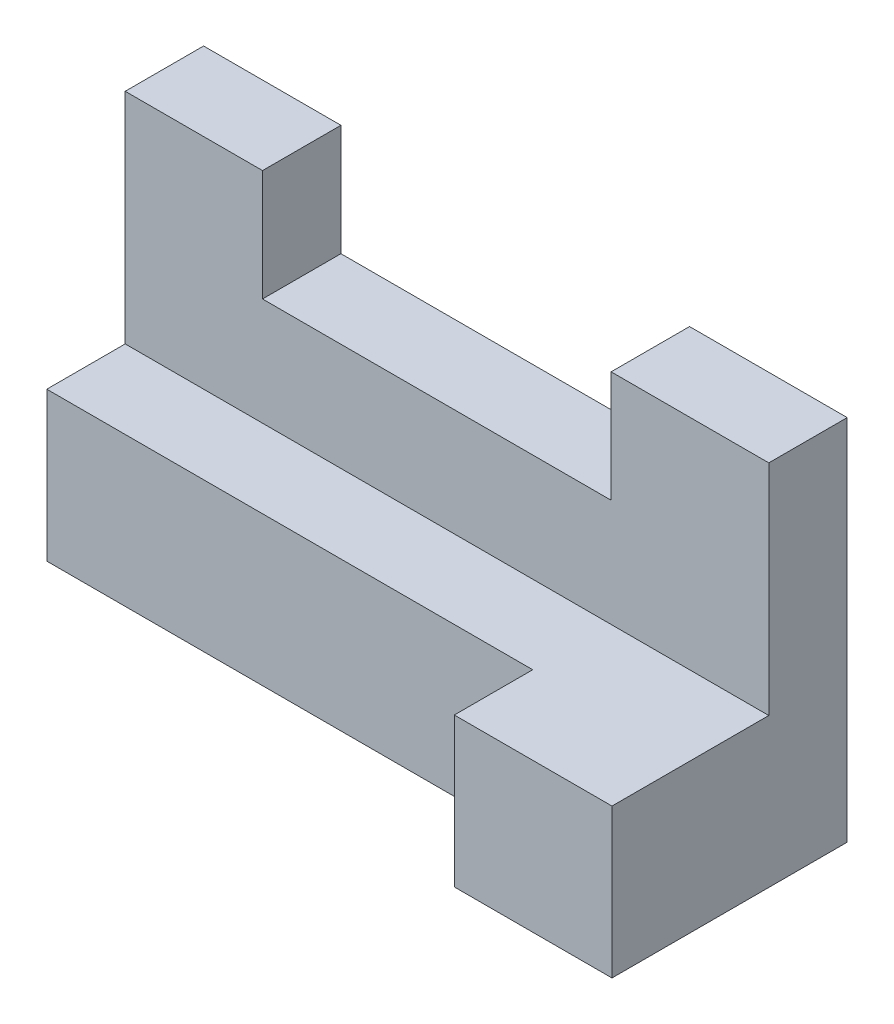
ISO-10303-21;
HEADER;
FILE_DESCRIPTION(('STEP AP214'),'2;1');
FILE_NAME('part.step','',(''),(''),'','','');
FILE_SCHEMA(('AUTOMOTIVE_DESIGN { 1 0 10303 214 1 1 1 1 }'));
ENDSEC;
DATA;
#1=APPLICATION_CONTEXT('core data for automotive mechanical design processes');
#2=APPLICATION_PROTOCOL_DEFINITION('international standard','automotive_design',2000,#1);
#3=PRODUCT_CONTEXT('',#1,'mechanical');
#4=PRODUCT('Part','Part','',(#3));
#5=PRODUCT_RELATED_PRODUCT_CATEGORY('part','',(#4));
#6=PRODUCT_DEFINITION_FORMATION('','',#4);
#7=PRODUCT_DEFINITION_CONTEXT('part definition',#1,'design');
#8=PRODUCT_DEFINITION('design','',#6,#7);
#9=PRODUCT_DEFINITION_SHAPE('','',#8);
#10=(LENGTH_UNIT() NAMED_UNIT(*) SI_UNIT(.MILLI.,.METRE.));
#11=(NAMED_UNIT(*) PLANE_ANGLE_UNIT() SI_UNIT($,.RADIAN.));
#12=(NAMED_UNIT(*) SI_UNIT($,.STERADIAN.) SOLID_ANGLE_UNIT());
#13=UNCERTAINTY_MEASURE_WITH_UNIT(LENGTH_MEASURE(1.E-05),#10,'distance_accuracy_value','');
#14=(GEOMETRIC_REPRESENTATION_CONTEXT(3) GLOBAL_UNCERTAINTY_ASSIGNED_CONTEXT((#13)) GLOBAL_UNIT_ASSIGNED_CONTEXT((#10,
#11,#12)) REPRESENTATION_CONTEXT('',''));
#15=CARTESIAN_POINT('',(0.,0.,0.));
#16=DIRECTION('',(0.,0.,1.));
#17=DIRECTION('',(1.,0.,0.));
#18=AXIS2_PLACEMENT_3D('',#15,#16,#17);
#19=CARTESIAN_POINT('',(-21.9935635111595,0.,10.));
#20=DIRECTION('',(-1.,0.,0.));
#21=DIRECTION('',(0.,0.,1.));
#22=AXIS2_PLACEMENT_3D('',#19,#20,#21);
#23=PLANE('',#22);
#24=DIRECTION('',(0.,1.,0.));
#25=VECTOR('',#24,1.);
#26=CARTESIAN_POINT('',(-21.9935635111595,0.,0.));
#27=LINE('',#26,#25);
#28=CARTESIAN_POINT('',(-21.9935635111595,13.7198793548755,0.));
#29=VERTEX_POINT('',#28);
#30=CARTESIAN_POINT('',(-21.9935635111595,27.9037178757274,0.));
#31=VERTEX_POINT('',#30);
#32=EDGE_CURVE('E124',#29,#31,#27,.T.);
#33=ORIENTED_EDGE('',*,*,#32,.T.);
#34=DIRECTION('',(0.,0.,-1.));
#35=VECTOR('',#34,1.);
#36=CARTESIAN_POINT('',(-21.9935635111595,27.9037178757274,10.));
#37=LINE('',#36,#35);
#38=CARTESIAN_POINT('',(-21.9935635111595,27.9037178757274,10.));
#39=VERTEX_POINT('',#38);
#40=EDGE_CURVE('E11',#39,#31,#37,.T.);
#41=ORIENTED_EDGE('',*,*,#40,.F.);
#42=DIRECTION('',(0.,1.,0.));
#43=VECTOR('',#42,1.);
#44=CARTESIAN_POINT('',(-21.9935635111595,0.,10.));
#45=LINE('',#44,#43);
#46=CARTESIAN_POINT('',(-21.9935635111595,13.7198793548755,10.));
#47=VERTEX_POINT('',#46);
#48=EDGE_CURVE('E139',#47,#39,#45,.T.);
#49=ORIENTED_EDGE('',*,*,#48,.F.);
#50=DIRECTION('',(0.,0.,-1.));
#51=VECTOR('',#50,1.);
#52=CARTESIAN_POINT('',(-21.9935635111595,13.7198793548755,10.));
#53=LINE('',#52,#51);
#54=EDGE_CURVE('E120',#47,#29,#53,.T.);
#55=ORIENTED_EDGE('',*,*,#54,.T.);
#56=EDGE_LOOP('',(#33,#41,#49,#55));
#57=FACE_BOUND('',#56,.T.);
#58=ADVANCED_FACE('F33',(#57),#23,.F.);
#59=CARTESIAN_POINT('',(0.,27.9037178757274,10.));
#60=DIRECTION('',(0.,-1.,0.));
#61=DIRECTION('',(0.,0.,-1.));
#62=AXIS2_PLACEMENT_3D('',#59,#60,#61);
#63=PLANE('',#62);
#64=DIRECTION('',(-1.,0.,0.));
#65=VECTOR('',#64,1.);
#66=CARTESIAN_POINT('',(0.,27.9037178757274,0.));
#67=LINE('',#66,#65);
#68=CARTESIAN_POINT('',(-39.5062947243976,27.9037178757274,0.));
#69=VERTEX_POINT('',#68);
#70=EDGE_CURVE('E127',#31,#69,#67,.T.);
#71=ORIENTED_EDGE('',*,*,#70,.T.);
#72=DIRECTION('',(0.,0.,-1.));
#73=VECTOR('',#72,1.);
#74=CARTESIAN_POINT('',(-39.5062947243976,27.9037178757274,10.));
#75=LINE('',#74,#73);
#76=CARTESIAN_POINT('',(-39.5062947243976,27.9037178757274,10.));
#77=VERTEX_POINT('',#76);
#78=EDGE_CURVE('E41',#77,#69,#75,.T.);
#79=ORIENTED_EDGE('',*,*,#78,.F.);
#80=DIRECTION('',(-1.,0.,0.));
#81=VECTOR('',#80,1.);
#82=CARTESIAN_POINT('',(0.,27.9037178757274,10.));
#83=LINE('',#82,#81);
#84=EDGE_CURVE('E87',#39,#77,#83,.T.);
#85=ORIENTED_EDGE('',*,*,#84,.F.);
#86=ORIENTED_EDGE('',*,*,#40,.T.);
#87=EDGE_LOOP('',(#71,#79,#85,#86));
#88=FACE_BOUND('',#87,.T.);
#89=ADVANCED_FACE('F152',(#88),#63,.F.);
#90=CARTESIAN_POINT('',(-39.5062947243976,0.,10.));
#91=DIRECTION('',(-1.,0.,0.));
#92=DIRECTION('',(0.,0.,1.));
#93=AXIS2_PLACEMENT_3D('',#90,#91,#92);
#94=PLANE('',#93);
#95=DIRECTION('',(0.,1.,0.));
#96=VECTOR('',#95,1.);
#97=CARTESIAN_POINT('',(-39.5062947243976,0.,0.));
#98=LINE('',#97,#96);
#99=CARTESIAN_POINT('',(-39.5062947243976,-18.992234217222,0.));
#100=VERTEX_POINT('',#99);
#101=EDGE_CURVE('E131',#100,#69,#98,.T.);
#102=ORIENTED_EDGE('',*,*,#101,.F.);
#103=DIRECTION('',(0.,0.,-1.));
#104=VECTOR('',#103,1.);
#105=CARTESIAN_POINT('',(-39.5062947243976,-18.992234217222,20.));
#106=LINE('',#105,#104);
#107=CARTESIAN_POINT('',(-39.5062947243976,-18.992234217222,20.));
#108=VERTEX_POINT('',#107);
#109=EDGE_CURVE('E170',#108,#100,#106,.T.);
#110=ORIENTED_EDGE('',*,*,#109,.F.);
#111=DIRECTION('',(0.,-1.,0.));
#112=VECTOR('',#111,1.);
#113=CARTESIAN_POINT('',(-39.5062947243976,0.,20.));
#114=LINE('',#113,#112);
#115=CARTESIAN_POINT('',(-39.5062947243976,0.,20.));
#116=VERTEX_POINT('',#115);
#117=EDGE_CURVE('E179',#116,#108,#114,.T.);
#118=ORIENTED_EDGE('',*,*,#117,.F.);
#119=DIRECTION('',(0.,0.,-1.));
#120=VECTOR('',#119,1.);
#121=CARTESIAN_POINT('',(-39.5062947243976,0.,20.));
#122=LINE('',#121,#120);
#123=CARTESIAN_POINT('',(-39.5062947243976,0.,10.));
#124=VERTEX_POINT('',#123);
#125=EDGE_CURVE('E167',#116,#124,#122,.T.);
#126=ORIENTED_EDGE('',*,*,#125,.T.);
#127=DIRECTION('',(0.,1.,0.));
#128=VECTOR('',#127,1.);
#129=CARTESIAN_POINT('',(-39.5062947243976,0.,10.));
#130=LINE('',#129,#128);
#131=EDGE_CURVE('E151',#124,#77,#130,.T.);
#132=ORIENTED_EDGE('',*,*,#131,.T.);
#133=ORIENTED_EDGE('',*,*,#78,.T.);
#134=EDGE_LOOP('',(#102,#110,#118,#126,#132,#133));
#135=FACE_BOUND('',#134,.T.);
#136=ADVANCED_FACE('F145',(#135),#94,.T.);
#137=CARTESIAN_POINT('',(42.5747448000789,0.,10.));
#138=DIRECTION('',(-1.,0.,0.));
#139=DIRECTION('',(0.,0.,1.));
#140=AXIS2_PLACEMENT_3D('',#137,#138,#139);
#141=PLANE('',#140);
#142=DIRECTION('',(0.,1.,0.));
#143=VECTOR('',#142,1.);
#144=CARTESIAN_POINT('',(42.5747448000789,0.,0.));
#145=LINE('',#144,#143);
#146=CARTESIAN_POINT('',(42.5747448000789,-18.992234217222,0.));
#147=VERTEX_POINT('',#146);
#148=CARTESIAN_POINT('',(42.5747448000789,27.9037178757274,0.));
#149=VERTEX_POINT('',#148);
#150=EDGE_CURVE('E134',#147,#149,#145,.T.);
#151=ORIENTED_EDGE('',*,*,#150,.T.);
#152=DIRECTION('',(0.,0.,-1.));
#153=VECTOR('',#152,1.);
#154=CARTESIAN_POINT('',(42.5747448000789,27.9037178757274,10.));
#155=LINE('',#154,#153);
#156=CARTESIAN_POINT('',(42.5747448000789,27.9037178757274,10.));
#157=VERTEX_POINT('',#156);
#158=EDGE_CURVE('E115',#157,#149,#155,.T.);
#159=ORIENTED_EDGE('',*,*,#158,.F.);
#160=DIRECTION('',(0.,1.,0.));
#161=VECTOR('',#160,1.);
#162=CARTESIAN_POINT('',(42.5747448000789,0.,10.));
#163=LINE('',#162,#161);
#164=CARTESIAN_POINT('',(42.5747448000789,0.,10.));
#165=VERTEX_POINT('',#164);
#166=EDGE_CURVE('E106',#165,#157,#163,.T.);
#167=ORIENTED_EDGE('',*,*,#166,.F.);
#168=DIRECTION('',(0.,0.,-1.));
#169=VECTOR('',#168,1.);
#170=CARTESIAN_POINT('',(42.5747448000789,0.,30.));
#171=LINE('',#170,#169);
#172=CARTESIAN_POINT('',(42.5747448000789,0.,30.));
#173=VERTEX_POINT('',#172);
#174=EDGE_CURVE('E193',#173,#165,#171,.T.);
#175=ORIENTED_EDGE('',*,*,#174,.F.);
#176=DIRECTION('',(0.,1.,0.));
#177=VECTOR('',#176,1.);
#178=CARTESIAN_POINT('',(42.5747448000789,0.,30.));
#179=LINE('',#178,#177);
#180=CARTESIAN_POINT('',(42.5747448000789,-18.992234217222,30.));
#181=VERTEX_POINT('',#180);
#182=EDGE_CURVE('E191',#181,#173,#179,.T.);
#183=ORIENTED_EDGE('',*,*,#182,.F.);
#184=DIRECTION('',(0.,0.,-1.));
#185=VECTOR('',#184,1.);
#186=CARTESIAN_POINT('',(42.5747448000789,-18.992234217222,30.));
#187=LINE('',#186,#185);
#188=EDGE_CURVE('E197',#181,#147,#187,.T.);
#189=ORIENTED_EDGE('',*,*,#188,.T.);
#190=EDGE_LOOP('',(#151,#159,#167,#175,#183,#189));
#191=FACE_BOUND('',#190,.T.);
#192=ADVANCED_FACE('F213',(#191),#141,.F.);
#193=CARTESIAN_POINT('',(0.,27.9037178757274,10.));
#194=DIRECTION('',(0.,-1.,0.));
#195=DIRECTION('',(0.,0.,-1.));
#196=AXIS2_PLACEMENT_3D('',#193,#194,#195);
#197=PLANE('',#196);
#198=DIRECTION('',(-1.,0.,0.));
#199=VECTOR('',#198,1.);
#200=CARTESIAN_POINT('',(0.,27.9037178757274,0.));
#201=LINE('',#200,#199);
#202=CARTESIAN_POINT('',(22.4651726618276,27.9037178757274,0.));
#203=VERTEX_POINT('',#202);
#204=EDGE_CURVE('E114',#149,#203,#201,.T.);
#205=ORIENTED_EDGE('',*,*,#204,.T.);
#206=DIRECTION('',(0.,0.,-1.));
#207=VECTOR('',#206,1.);
#208=CARTESIAN_POINT('',(22.4651726618276,27.9037178757274,10.));
#209=LINE('',#208,#207);
#210=CARTESIAN_POINT('',(22.4651726618276,27.9037178757274,10.));
#211=VERTEX_POINT('',#210);
#212=EDGE_CURVE('E111',#211,#203,#209,.T.);
#213=ORIENTED_EDGE('',*,*,#212,.F.);
#214=DIRECTION('',(-1.,0.,0.));
#215=VECTOR('',#214,1.);
#216=CARTESIAN_POINT('',(0.,27.9037178757274,10.));
#217=LINE('',#216,#215);
#218=EDGE_CURVE('E100',#157,#211,#217,.T.);
#219=ORIENTED_EDGE('',*,*,#218,.F.);
#220=ORIENTED_EDGE('',*,*,#158,.T.);
#221=EDGE_LOOP('',(#205,#213,#219,#220));
#222=FACE_BOUND('',#221,.T.);
#223=ADVANCED_FACE('F112',(#222),#197,.F.);
#224=CARTESIAN_POINT('',(22.4651726618276,0.,10.));
#225=DIRECTION('',(1.,0.,0.));
#226=DIRECTION('',(0.,0.,-1.));
#227=AXIS2_PLACEMENT_3D('',#224,#225,#226);
#228=PLANE('',#227);
#229=DIRECTION('',(0.,-1.,0.));
#230=VECTOR('',#229,1.);
#231=CARTESIAN_POINT('',(22.4651726618276,0.,0.));
#232=LINE('',#231,#230);
#233=CARTESIAN_POINT('',(22.4651726618276,13.7198793548755,0.));
#234=VERTEX_POINT('',#233);
#235=EDGE_CURVE('E73',#203,#234,#232,.T.);
#236=ORIENTED_EDGE('',*,*,#235,.T.);
#237=DIRECTION('',(0.,0.,-1.));
#238=VECTOR('',#237,1.);
#239=CARTESIAN_POINT('',(22.4651726618276,13.7198793548755,10.));
#240=LINE('',#239,#238);
#241=CARTESIAN_POINT('',(22.4651726618276,13.7198793548755,10.));
#242=VERTEX_POINT('',#241);
#243=EDGE_CURVE('E116',#242,#234,#240,.T.);
#244=ORIENTED_EDGE('',*,*,#243,.F.);
#245=DIRECTION('',(0.,-1.,0.));
#246=VECTOR('',#245,1.);
#247=CARTESIAN_POINT('',(22.4651726618276,0.,10.));
#248=LINE('',#247,#246);
#249=EDGE_CURVE('E104',#211,#242,#248,.T.);
#250=ORIENTED_EDGE('',*,*,#249,.F.);
#251=ORIENTED_EDGE('',*,*,#212,.T.);
#252=EDGE_LOOP('',(#236,#244,#250,#251));
#253=FACE_BOUND('',#252,.T.);
#254=ADVANCED_FACE('F118',(#253),#228,.F.);
#255=CARTESIAN_POINT('',(0.,13.7198793548755,10.));
#256=DIRECTION('',(0.,-1.,0.));
#257=DIRECTION('',(0.,0.,-1.));
#258=AXIS2_PLACEMENT_3D('',#255,#256,#257);
#259=PLANE('',#258);
#260=DIRECTION('',(-1.,0.,0.));
#261=VECTOR('',#260,1.);
#262=CARTESIAN_POINT('',(0.,13.7198793548755,0.));
#263=LINE('',#262,#261);
#264=EDGE_CURVE('E79',#234,#29,#263,.T.);
#265=ORIENTED_EDGE('',*,*,#264,.T.);
#266=ORIENTED_EDGE('',*,*,#54,.F.);
#267=DIRECTION('',(-1.,0.,0.));
#268=VECTOR('',#267,1.);
#269=CARTESIAN_POINT('',(0.,13.7198793548755,10.));
#270=LINE('',#269,#268);
#271=EDGE_CURVE('E49',#242,#47,#270,.T.);
#272=ORIENTED_EDGE('',*,*,#271,.F.);
#273=ORIENTED_EDGE('',*,*,#243,.T.);
#274=EDGE_LOOP('',(#265,#266,#272,#273));
#275=FACE_BOUND('',#274,.T.);
#276=ADVANCED_FACE('F233',(#275),#259,.F.);
#277=CARTESIAN_POINT('',(0.,0.,10.));
#278=DIRECTION('',(0.,0.,1.));
#279=DIRECTION('',(1.,0.,0.));
#280=AXIS2_PLACEMENT_3D('',#277,#278,#279);
#281=PLANE('',#280);
#282=ORIENTED_EDGE('',*,*,#48,.T.);
#283=ORIENTED_EDGE('',*,*,#84,.T.);
#284=ORIENTED_EDGE('',*,*,#131,.F.);
#285=DIRECTION('',(1.,0.,0.));
#286=VECTOR('',#285,1.);
#287=CARTESIAN_POINT('',(0.,0.,10.));
#288=LINE('',#287,#286);
#289=EDGE_CURVE('E206',#124,#165,#288,.T.);
#290=ORIENTED_EDGE('',*,*,#289,.T.);
#291=ORIENTED_EDGE('',*,*,#166,.T.);
#292=ORIENTED_EDGE('',*,*,#218,.T.);
#293=ORIENTED_EDGE('',*,*,#249,.T.);
#294=ORIENTED_EDGE('',*,*,#271,.T.);
#295=EDGE_LOOP('',(#282,#283,#284,#290,#291,#292,#293,#294));
#296=FACE_BOUND('',#295,.T.);
#297=ADVANCED_FACE('F102',(#296),#281,.T.);
#298=CARTESIAN_POINT('',(0.,0.,0.));
#299=DIRECTION('',(0.,0.,1.));
#300=DIRECTION('',(1.,0.,0.));
#301=AXIS2_PLACEMENT_3D('',#298,#299,#300);
#302=PLANE('',#301);
#303=ORIENTED_EDGE('',*,*,#32,.F.);
#304=ORIENTED_EDGE('',*,*,#264,.F.);
#305=ORIENTED_EDGE('',*,*,#235,.F.);
#306=ORIENTED_EDGE('',*,*,#204,.F.);
#307=ORIENTED_EDGE('',*,*,#150,.F.);
#308=DIRECTION('',(1.,0.,0.));
#309=VECTOR('',#308,1.);
#310=CARTESIAN_POINT('',(0.,-18.992234217222,0.));
#311=LINE('',#310,#309);
#312=EDGE_CURVE('E159',#100,#147,#311,.T.);
#313=ORIENTED_EDGE('',*,*,#312,.F.);
#314=ORIENTED_EDGE('',*,*,#101,.T.);
#315=ORIENTED_EDGE('',*,*,#70,.F.);
#316=EDGE_LOOP('',(#303,#304,#305,#306,#307,#313,#314,#315));
#317=FACE_BOUND('',#316,.T.);
#318=ADVANCED_FACE('F156',(#317),#302,.F.);
#319=CARTESIAN_POINT('',(0.,0.,30.));
#320=DIRECTION('',(0.,1.,0.));
#321=DIRECTION('',(0.,0.,1.));
#322=AXIS2_PLACEMENT_3D('',#319,#320,#321);
#323=PLANE('',#322);
#324=ORIENTED_EDGE('',*,*,#174,.T.);
#325=ORIENTED_EDGE('',*,*,#289,.F.);
#326=ORIENTED_EDGE('',*,*,#125,.F.);
#327=DIRECTION('',(1.,0.,0.));
#328=VECTOR('',#327,1.);
#329=CARTESIAN_POINT('',(0.,0.,20.));
#330=LINE('',#329,#328);
#331=CARTESIAN_POINT('',(22.4651726618276,0.,20.));
#332=VERTEX_POINT('',#331);
#333=EDGE_CURVE('E350',#116,#332,#330,.T.);
#334=ORIENTED_EDGE('',*,*,#333,.T.);
#335=DIRECTION('',(0.,0.,-1.));
#336=VECTOR('',#335,1.);
#337=CARTESIAN_POINT('',(22.4651726618276,0.,30.));
#338=LINE('',#337,#336);
#339=CARTESIAN_POINT('',(22.4651726618276,0.,30.));
#340=VERTEX_POINT('',#339);
#341=EDGE_CURVE('E128',#340,#332,#338,.T.);
#342=ORIENTED_EDGE('',*,*,#341,.F.);
#343=DIRECTION('',(1.,0.,0.));
#344=VECTOR('',#343,1.);
#345=CARTESIAN_POINT('',(0.,0.,30.));
#346=LINE('',#345,#344);
#347=EDGE_CURVE('E166',#340,#173,#346,.T.);
#348=ORIENTED_EDGE('',*,*,#347,.T.);
#349=EDGE_LOOP('',(#324,#325,#326,#334,#342,#348));
#350=FACE_BOUND('',#349,.T.);
#351=ADVANCED_FACE('F215',(#350),#323,.T.);
#352=CARTESIAN_POINT('',(22.4651726618276,0.,30.));
#353=DIRECTION('',(1.,0.,0.));
#354=DIRECTION('',(0.,0.,-1.));
#355=AXIS2_PLACEMENT_3D('',#352,#353,#354);
#356=PLANE('',#355);
#357=ORIENTED_EDGE('',*,*,#341,.T.);
#358=DIRECTION('',(0.,-1.,0.));
#359=VECTOR('',#358,1.);
#360=CARTESIAN_POINT('',(22.4651726618276,0.,20.));
#361=LINE('',#360,#359);
#362=CARTESIAN_POINT('',(22.4651726618276,-18.992234217222,20.));
#363=VERTEX_POINT('',#362);
#364=EDGE_CURVE('E347',#332,#363,#361,.T.);
#365=ORIENTED_EDGE('',*,*,#364,.T.);
#366=DIRECTION('',(0.,0.,-1.));
#367=VECTOR('',#366,1.);
#368=CARTESIAN_POINT('',(22.4651726618276,-18.992234217222,30.));
#369=LINE('',#368,#367);
#370=CARTESIAN_POINT('',(22.4651726618276,-18.992234217222,30.));
#371=VERTEX_POINT('',#370);
#372=EDGE_CURVE('E199',#371,#363,#369,.T.);
#373=ORIENTED_EDGE('',*,*,#372,.F.);
#374=DIRECTION('',(0.,-1.,0.));
#375=VECTOR('',#374,1.);
#376=CARTESIAN_POINT('',(22.4651726618276,0.,30.));
#377=LINE('',#376,#375);
#378=EDGE_CURVE('E185',#340,#371,#377,.T.);
#379=ORIENTED_EDGE('',*,*,#378,.F.);
#380=EDGE_LOOP('',(#357,#365,#373,#379));
#381=FACE_BOUND('',#380,.T.);
#382=ADVANCED_FACE('F315',(#381),#356,.F.);
#383=CARTESIAN_POINT('',(0.,-18.992234217222,30.));
#384=DIRECTION('',(0.,1.,0.));
#385=DIRECTION('',(0.,0.,1.));
#386=AXIS2_PLACEMENT_3D('',#383,#384,#385);
#387=PLANE('',#386);
#388=ORIENTED_EDGE('',*,*,#312,.T.);
#389=ORIENTED_EDGE('',*,*,#188,.F.);
#390=DIRECTION('',(1.,0.,0.));
#391=VECTOR('',#390,1.);
#392=CARTESIAN_POINT('',(0.,-18.992234217222,30.));
#393=LINE('',#392,#391);
#394=EDGE_CURVE('E188',#371,#181,#393,.T.);
#395=ORIENTED_EDGE('',*,*,#394,.F.);
#396=ORIENTED_EDGE('',*,*,#372,.T.);
#397=DIRECTION('',(1.,0.,0.));
#398=VECTOR('',#397,1.);
#399=CARTESIAN_POINT('',(0.,-18.992234217222,20.));
#400=LINE('',#399,#398);
#401=EDGE_CURVE('E175',#108,#363,#400,.T.);
#402=ORIENTED_EDGE('',*,*,#401,.F.);
#403=ORIENTED_EDGE('',*,*,#109,.T.);
#404=EDGE_LOOP('',(#388,#389,#395,#396,#402,#403));
#405=FACE_BOUND('',#404,.T.);
#406=ADVANCED_FACE('F171',(#405),#387,.F.);
#407=CARTESIAN_POINT('',(0.,0.,30.));
#408=DIRECTION('',(0.,0.,1.));
#409=DIRECTION('',(1.,0.,0.));
#410=AXIS2_PLACEMENT_3D('',#407,#408,#409);
#411=PLANE('',#410);
#412=ORIENTED_EDGE('',*,*,#347,.F.);
#413=ORIENTED_EDGE('',*,*,#378,.T.);
#414=ORIENTED_EDGE('',*,*,#394,.T.);
#415=ORIENTED_EDGE('',*,*,#182,.T.);
#416=EDGE_LOOP('',(#412,#413,#414,#415));
#417=FACE_BOUND('',#416,.T.);
#418=ADVANCED_FACE('F223',(#417),#411,.T.);
#419=CARTESIAN_POINT('',(0.,0.,20.));
#420=DIRECTION('',(0.,0.,1.));
#421=DIRECTION('',(1.,0.,0.));
#422=AXIS2_PLACEMENT_3D('',#419,#420,#421);
#423=PLANE('',#422);
#424=ORIENTED_EDGE('',*,*,#364,.F.);
#425=ORIENTED_EDGE('',*,*,#333,.F.);
#426=ORIENTED_EDGE('',*,*,#117,.T.);
#427=ORIENTED_EDGE('',*,*,#401,.T.);
#428=EDGE_LOOP('',(#424,#425,#426,#427));
#429=FACE_BOUND('',#428,.T.);
#430=ADVANCED_FACE('F284',(#429),#423,.T.);
#431=CLOSED_SHELL('',(#58,#89,#136,#192,#223,#254,#276,#297,#318,#351,#382,#406,#418,#430));
#432=MANIFOLD_SOLID_BREP('B2',#431);
#433=ADVANCED_BREP_SHAPE_REPRESENTATION('',(#18,#432),#14);
#434=SHAPE_DEFINITION_REPRESENTATION(#9,#433);
ENDSEC;
END-ISO-10303-21;
